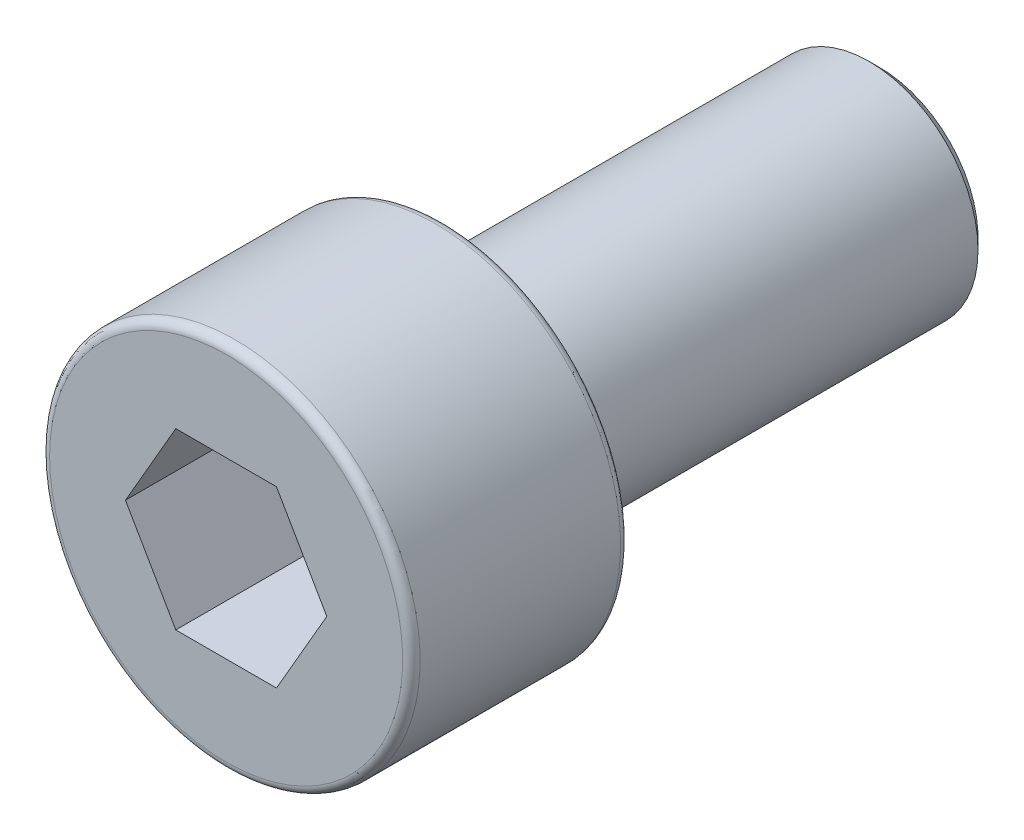
ISO-10303-21;
HEADER;
FILE_DESCRIPTION(('STEP AP214'),'2;1');
FILE_NAME('part.step','',(''),(''),'','','');
FILE_SCHEMA(('AUTOMOTIVE_DESIGN { 1 0 10303 214 1 1 1 1 }'));
ENDSEC;
DATA;
#1=APPLICATION_CONTEXT('core data for automotive mechanical design processes');
#2=APPLICATION_PROTOCOL_DEFINITION('international standard','automotive_design',2000,#1);
#3=PRODUCT_CONTEXT('',#1,'mechanical');
#4=PRODUCT('Part','Part','',(#3));
#5=PRODUCT_RELATED_PRODUCT_CATEGORY('part','',(#4));
#6=PRODUCT_DEFINITION_FORMATION('','',#4);
#7=PRODUCT_DEFINITION_CONTEXT('part definition',#1,'design');
#8=PRODUCT_DEFINITION('design','',#6,#7);
#9=PRODUCT_DEFINITION_SHAPE('','',#8);
#10=(LENGTH_UNIT() NAMED_UNIT(*) SI_UNIT(.MILLI.,.METRE.));
#11=(NAMED_UNIT(*) PLANE_ANGLE_UNIT() SI_UNIT($,.RADIAN.));
#12=(NAMED_UNIT(*) SI_UNIT($,.STERADIAN.) SOLID_ANGLE_UNIT());
#13=UNCERTAINTY_MEASURE_WITH_UNIT(LENGTH_MEASURE(1.E-05),#10,'distance_accuracy_value','');
#14=(GEOMETRIC_REPRESENTATION_CONTEXT(3) GLOBAL_UNCERTAINTY_ASSIGNED_CONTEXT((#13)) GLOBAL_UNIT_ASSIGNED_CONTEXT((#10,
#11,#12)) REPRESENTATION_CONTEXT('',''));
#15=CARTESIAN_POINT('',(0.,0.,0.));
#16=DIRECTION('',(0.,0.,1.));
#17=DIRECTION('',(1.,0.,0.));
#18=AXIS2_PLACEMENT_3D('',#15,#16,#17);
#19=CARTESIAN_POINT('',(0.,0.,10.));
#20=DIRECTION('',(0.,0.,-1.));
#21=DIRECTION('',(-1.,0.,0.));
#22=AXIS2_PLACEMENT_3D('',#19,#20,#21);
#23=PLANE('',#22);
#24=CARTESIAN_POINT('',(0.,0.,10.));
#25=DIRECTION('',(0.,0.,-1.));
#26=DIRECTION('',(-1.,0.,0.));
#27=AXIS2_PLACEMENT_3D('',#24,#25,#26);
#28=CIRCLE('',#27,4.05);
#29=CARTESIAN_POINT('',(-4.05,0.,10.));
#30=VERTEX_POINT('',#29);
#31=EDGE_CURVE('E40',#30,#30,#28,.T.);
#32=ORIENTED_EDGE('',*,*,#31,.T.);
#33=EDGE_LOOP('',(#32));
#34=FACE_BOUND('',#33,.T.);
#35=CARTESIAN_POINT('',(0.,0.,10.));
#36=DIRECTION('',(0.,0.,-1.));
#37=DIRECTION('',(-1.,0.,0.));
#38=AXIS2_PLACEMENT_3D('',#35,#36,#37);
#39=CIRCLE('',#38,2.5);
#40=CARTESIAN_POINT('',(-2.5,0.,10.));
#41=VERTEX_POINT('',#40);
#42=EDGE_CURVE('E134',#41,#41,#39,.T.);
#43=ORIENTED_EDGE('',*,*,#42,.F.);
#44=EDGE_LOOP('',(#43));
#45=FACE_BOUND('',#44,.T.);
#46=ADVANCED_FACE('F32',(#34,#45),#23,.T.);
#47=CARTESIAN_POINT('',(0.,0.,10.));
#48=DIRECTION('',(0.,0.,1.));
#49=DIRECTION('',(1.,0.,0.));
#50=AXIS2_PLACEMENT_3D('',#47,#48,#49);
#51=CYLINDRICAL_SURFACE('',#50,4.25);
#52=CARTESIAN_POINT('',(0.,0.,10.2));
#53=DIRECTION('',(0.,0.,-1.));
#54=DIRECTION('',(-1.,0.,0.));
#55=AXIS2_PLACEMENT_3D('',#52,#53,#54);
#56=CIRCLE('',#55,4.25);
#57=CARTESIAN_POINT('',(-4.25,0.,10.2));
#58=VERTEX_POINT('',#57);
#59=EDGE_CURVE('E151',#58,#58,#56,.F.);
#60=ORIENTED_EDGE('',*,*,#59,.T.);
#61=EDGE_LOOP('',(#60));
#62=FACE_BOUND('',#61,.T.);
#63=CARTESIAN_POINT('',(0.,0.,14.8));
#64=DIRECTION('',(0.,0.,-1.));
#65=DIRECTION('',(-1.,0.,0.));
#66=AXIS2_PLACEMENT_3D('',#63,#64,#65);
#67=CIRCLE('',#66,4.25);
#68=CARTESIAN_POINT('',(-4.25,0.,14.8));
#69=VERTEX_POINT('',#68);
#70=EDGE_CURVE('E148',#69,#69,#67,.T.);
#71=ORIENTED_EDGE('',*,*,#70,.T.);
#72=EDGE_LOOP('',(#71));
#73=FACE_BOUND('',#72,.T.);
#74=ADVANCED_FACE('F164',(#62,#73),#51,.T.);
#75=CARTESIAN_POINT('',(0.,0.,15.));
#76=DIRECTION('',(0.,0.,-1.));
#77=DIRECTION('',(-1.,0.,0.));
#78=AXIS2_PLACEMENT_3D('',#75,#76,#77);
#79=PLANE('',#78);
#80=CARTESIAN_POINT('',(0.,0.,15.));
#81=DIRECTION('',(0.,0.,-1.));
#82=DIRECTION('',(-1.,0.,0.));
#83=AXIS2_PLACEMENT_3D('',#80,#81,#82);
#84=CIRCLE('',#83,4.05);
#85=CARTESIAN_POINT('',(-4.05,0.,15.));
#86=VERTEX_POINT('',#85);
#87=EDGE_CURVE('E11',#86,#86,#84,.F.);
#88=ORIENTED_EDGE('',*,*,#87,.T.);
#89=EDGE_LOOP('',(#88));
#90=FACE_BOUND('',#89,.T.);
#91=DIRECTION('',(0.499999999999999,-0.866025403784439,0.));
#92=VECTOR('',#91,1.);
#93=CARTESIAN_POINT('',(-2.3094010767585,0.,15.));
#94=LINE('',#93,#92);
#95=CARTESIAN_POINT('',(-2.3094010767585,0.,15.));
#96=VERTEX_POINT('',#95);
#97=CARTESIAN_POINT('',(-1.15470053837925,-2.,15.));
#98=VERTEX_POINT('',#97);
#99=EDGE_CURVE('E121',#96,#98,#94,.T.);
#100=ORIENTED_EDGE('',*,*,#99,.F.);
#101=DIRECTION('',(-0.499999999999999,-0.866025403784439,0.));
#102=VECTOR('',#101,1.);
#103=CARTESIAN_POINT('',(-1.15470053837925,2.,15.));
#104=LINE('',#103,#102);
#105=CARTESIAN_POINT('',(-1.15470053837925,2.,15.));
#106=VERTEX_POINT('',#105);
#107=EDGE_CURVE('E47',#106,#96,#104,.T.);
#108=ORIENTED_EDGE('',*,*,#107,.F.);
#109=DIRECTION('',(-1.,0.,0.));
#110=VECTOR('',#109,1.);
#111=CARTESIAN_POINT('',(1.15470053837925,2.,15.));
#112=LINE('',#111,#110);
#113=CARTESIAN_POINT('',(1.15470053837925,2.,15.));
#114=VERTEX_POINT('',#113);
#115=EDGE_CURVE('E130',#114,#106,#112,.T.);
#116=ORIENTED_EDGE('',*,*,#115,.F.);
#117=DIRECTION('',(-0.499999999999999,0.866025403784439,0.));
#118=VECTOR('',#117,1.);
#119=CARTESIAN_POINT('',(2.3094010767585,0.,15.));
#120=LINE('',#119,#118);
#121=CARTESIAN_POINT('',(2.3094010767585,0.,15.));
#122=VERTEX_POINT('',#121);
#123=EDGE_CURVE('E128',#122,#114,#120,.T.);
#124=ORIENTED_EDGE('',*,*,#123,.F.);
#125=DIRECTION('',(0.499999999999999,0.866025403784439,0.));
#126=VECTOR('',#125,1.);
#127=CARTESIAN_POINT('',(1.15470053837925,-2.,15.));
#128=LINE('',#127,#126);
#129=CARTESIAN_POINT('',(1.15470053837925,-2.,15.));
#130=VERTEX_POINT('',#129);
#131=EDGE_CURVE('E95',#130,#122,#128,.T.);
#132=ORIENTED_EDGE('',*,*,#131,.F.);
#133=DIRECTION('',(1.,0.,0.));
#134=VECTOR('',#133,1.);
#135=CARTESIAN_POINT('',(-1.15470053837925,-2.,15.));
#136=LINE('',#135,#134);
#137=EDGE_CURVE('E124',#98,#130,#136,.T.);
#138=ORIENTED_EDGE('',*,*,#137,.F.);
#139=EDGE_LOOP('',(#100,#108,#116,#124,#132,#138));
#140=FACE_BOUND('',#139,.T.);
#141=ADVANCED_FACE('F167',(#90,#140),#79,.F.);
#142=CARTESIAN_POINT('',(0.,0.,0.));
#143=DIRECTION('',(0.,0.,1.));
#144=DIRECTION('',(1.,0.,0.));
#145=AXIS2_PLACEMENT_3D('',#142,#143,#144);
#146=CYLINDRICAL_SURFACE('',#145,2.5);
#147=CARTESIAN_POINT('',(0.,0.,0.250000000055023));
#148=DIRECTION('',(0.,0.,-1.));
#149=DIRECTION('',(-1.,0.,0.));
#150=AXIS2_PLACEMENT_3D('',#147,#148,#149);
#151=CIRCLE('',#150,2.5);
#152=CARTESIAN_POINT('',(-2.5,0.,0.250000000055023));
#153=VERTEX_POINT('',#152);
#154=EDGE_CURVE('E145',#153,#153,#151,.F.);
#155=ORIENTED_EDGE('',*,*,#154,.T.);
#156=EDGE_LOOP('',(#155));
#157=FACE_BOUND('',#156,.T.);
#158=ORIENTED_EDGE('',*,*,#42,.T.);
#159=EDGE_LOOP('',(#158));
#160=FACE_BOUND('',#159,.T.);
#161=ADVANCED_FACE('F177',(#157,#160),#146,.T.);
#162=CARTESIAN_POINT('',(0.,0.,0.));
#163=DIRECTION('',(0.,0.,-1.));
#164=DIRECTION('',(-1.,0.,0.));
#165=AXIS2_PLACEMENT_3D('',#162,#163,#164);
#166=PLANE('',#165);
#167=CARTESIAN_POINT('',(0.,0.,0.));
#168=DIRECTION('',(0.,0.,-1.));
#169=DIRECTION('',(-1.,0.,0.));
#170=AXIS2_PLACEMENT_3D('',#167,#168,#169);
#171=CIRCLE('',#170,2.24999999994497);
#172=CARTESIAN_POINT('',(-2.24999999994497,0.,0.));
#173=VERTEX_POINT('',#172);
#174=EDGE_CURVE('E142',#173,#173,#171,.T.);
#175=ORIENTED_EDGE('',*,*,#174,.T.);
#176=EDGE_LOOP('',(#175));
#177=FACE_BOUND('',#176,.T.);
#178=ADVANCED_FACE('F188',(#177),#166,.T.);
#179=CARTESIAN_POINT('',(-1.15470053837925,2.,11.));
#180=DIRECTION('',(-0.866025403784439,0.499999999999999,0.));
#181=DIRECTION('',(-0.499999999999999,-0.866025403784439,0.));
#182=AXIS2_PLACEMENT_3D('',#179,#180,#181);
#183=PLANE('',#182);
#184=ORIENTED_EDGE('',*,*,#107,.T.);
#185=DIRECTION('',(0.,0.,1.));
#186=VECTOR('',#185,1.);
#187=CARTESIAN_POINT('',(-2.3094010767585,0.,11.));
#188=LINE('',#187,#186);
#189=CARTESIAN_POINT('',(-2.3094010767585,0.,11.));
#190=VERTEX_POINT('',#189);
#191=EDGE_CURVE('E77',#190,#96,#188,.T.);
#192=ORIENTED_EDGE('',*,*,#191,.F.);
#193=DIRECTION('',(-0.499999999999999,-0.866025403784439,0.));
#194=VECTOR('',#193,1.);
#195=CARTESIAN_POINT('',(-1.15470053837925,2.,11.));
#196=LINE('',#195,#194);
#197=CARTESIAN_POINT('',(-1.15470053837925,2.,11.));
#198=VERTEX_POINT('',#197);
#199=EDGE_CURVE('E132',#198,#190,#196,.T.);
#200=ORIENTED_EDGE('',*,*,#199,.F.);
#201=DIRECTION('',(0.,0.,1.));
#202=VECTOR('',#201,1.);
#203=CARTESIAN_POINT('',(-1.15470053837925,2.,11.));
#204=LINE('',#203,#202);
#205=EDGE_CURVE('E55',#198,#106,#204,.T.);
#206=ORIENTED_EDGE('',*,*,#205,.T.);
#207=EDGE_LOOP('',(#184,#192,#200,#206));
#208=FACE_BOUND('',#207,.T.);
#209=ADVANCED_FACE('F185',(#208),#183,.F.);
#210=CARTESIAN_POINT('',(1.15470053837925,2.,11.));
#211=DIRECTION('',(0.,1.,0.));
#212=DIRECTION('',(-1.,0.,0.));
#213=AXIS2_PLACEMENT_3D('',#210,#211,#212);
#214=PLANE('',#213);
#215=ORIENTED_EDGE('',*,*,#115,.T.);
#216=ORIENTED_EDGE('',*,*,#205,.F.);
#217=DIRECTION('',(-1.,0.,0.));
#218=VECTOR('',#217,1.);
#219=CARTESIAN_POINT('',(1.15470053837925,2.,11.));
#220=LINE('',#219,#218);
#221=CARTESIAN_POINT('',(1.15470053837925,2.,11.));
#222=VERTEX_POINT('',#221);
#223=EDGE_CURVE('E107',#222,#198,#220,.T.);
#224=ORIENTED_EDGE('',*,*,#223,.F.);
#225=DIRECTION('',(0.,0.,1.));
#226=VECTOR('',#225,1.);
#227=CARTESIAN_POINT('',(1.15470053837925,2.,11.));
#228=LINE('',#227,#226);
#229=EDGE_CURVE('E99',#222,#114,#228,.T.);
#230=ORIENTED_EDGE('',*,*,#229,.T.);
#231=EDGE_LOOP('',(#215,#216,#224,#230));
#232=FACE_BOUND('',#231,.T.);
#233=ADVANCED_FACE('F187',(#232),#214,.F.);
#234=CARTESIAN_POINT('',(2.3094010767585,0.,11.));
#235=DIRECTION('',(0.866025403784439,0.499999999999999,0.));
#236=DIRECTION('',(-0.499999999999999,0.866025403784439,0.));
#237=AXIS2_PLACEMENT_3D('',#234,#235,#236);
#238=PLANE('',#237);
#239=ORIENTED_EDGE('',*,*,#123,.T.);
#240=ORIENTED_EDGE('',*,*,#229,.F.);
#241=DIRECTION('',(-0.499999999999999,0.866025403784439,0.));
#242=VECTOR('',#241,1.);
#243=CARTESIAN_POINT('',(2.3094010767585,0.,11.));
#244=LINE('',#243,#242);
#245=CARTESIAN_POINT('',(2.3094010767585,0.,11.));
#246=VERTEX_POINT('',#245);
#247=EDGE_CURVE('E103',#246,#222,#244,.T.);
#248=ORIENTED_EDGE('',*,*,#247,.F.);
#249=DIRECTION('',(0.,0.,1.));
#250=VECTOR('',#249,1.);
#251=CARTESIAN_POINT('',(2.3094010767585,0.,11.));
#252=LINE('',#251,#250);
#253=EDGE_CURVE('E88',#246,#122,#252,.T.);
#254=ORIENTED_EDGE('',*,*,#253,.T.);
#255=EDGE_LOOP('',(#239,#240,#248,#254));
#256=FACE_BOUND('',#255,.T.);
#257=ADVANCED_FACE('F104',(#256),#238,.F.);
#258=CARTESIAN_POINT('',(1.15470053837925,-2.,11.));
#259=DIRECTION('',(0.866025403784439,-0.5,0.));
#260=DIRECTION('',(0.5,0.866025403784439,0.));
#261=AXIS2_PLACEMENT_3D('',#258,#259,#260);
#262=PLANE('',#261);
#263=ORIENTED_EDGE('',*,*,#131,.T.);
#264=ORIENTED_EDGE('',*,*,#253,.F.);
#265=DIRECTION('',(0.499999999999999,0.866025403784439,0.));
#266=VECTOR('',#265,1.);
#267=CARTESIAN_POINT('',(1.15470053837925,-2.,11.));
#268=LINE('',#267,#266);
#269=CARTESIAN_POINT('',(1.15470053837925,-2.,11.));
#270=VERTEX_POINT('',#269);
#271=EDGE_CURVE('E92',#270,#246,#268,.T.);
#272=ORIENTED_EDGE('',*,*,#271,.F.);
#273=DIRECTION('',(0.,0.,1.));
#274=VECTOR('',#273,1.);
#275=CARTESIAN_POINT('',(1.15470053837925,-2.,11.));
#276=LINE('',#275,#274);
#277=EDGE_CURVE('E100',#270,#130,#276,.T.);
#278=ORIENTED_EDGE('',*,*,#277,.T.);
#279=EDGE_LOOP('',(#263,#264,#272,#278));
#280=FACE_BOUND('',#279,.T.);
#281=ADVANCED_FACE('F90',(#280),#262,.F.);
#282=CARTESIAN_POINT('',(-1.15470053837925,-2.,11.));
#283=DIRECTION('',(0.,-1.,0.));
#284=DIRECTION('',(1.,0.,0.));
#285=AXIS2_PLACEMENT_3D('',#282,#283,#284);
#286=PLANE('',#285);
#287=ORIENTED_EDGE('',*,*,#137,.T.);
#288=ORIENTED_EDGE('',*,*,#277,.F.);
#289=DIRECTION('',(1.,0.,0.));
#290=VECTOR('',#289,1.);
#291=CARTESIAN_POINT('',(-1.15470053837925,-2.,11.));
#292=LINE('',#291,#290);
#293=CARTESIAN_POINT('',(-1.15470053837925,-2.,11.));
#294=VERTEX_POINT('',#293);
#295=EDGE_CURVE('E113',#294,#270,#292,.T.);
#296=ORIENTED_EDGE('',*,*,#295,.F.);
#297=DIRECTION('',(0.,0.,1.));
#298=VECTOR('',#297,1.);
#299=CARTESIAN_POINT('',(-1.15470053837925,-2.,11.));
#300=LINE('',#299,#298);
#301=EDGE_CURVE('E137',#294,#98,#300,.T.);
#302=ORIENTED_EDGE('',*,*,#301,.T.);
#303=EDGE_LOOP('',(#287,#288,#296,#302));
#304=FACE_BOUND('',#303,.T.);
#305=ADVANCED_FACE('F273',(#304),#286,.F.);
#306=CARTESIAN_POINT('',(-2.3094010767585,0.,11.));
#307=DIRECTION('',(-0.866025403784439,-0.499999999999999,0.));
#308=DIRECTION('',(0.499999999999999,-0.866025403784439,0.));
#309=AXIS2_PLACEMENT_3D('',#306,#307,#308);
#310=PLANE('',#309);
#311=ORIENTED_EDGE('',*,*,#99,.T.);
#312=ORIENTED_EDGE('',*,*,#301,.F.);
#313=DIRECTION('',(0.499999999999999,-0.866025403784439,0.));
#314=VECTOR('',#313,1.);
#315=CARTESIAN_POINT('',(-2.3094010767585,0.,11.));
#316=LINE('',#315,#314);
#317=EDGE_CURVE('E115',#190,#294,#316,.T.);
#318=ORIENTED_EDGE('',*,*,#317,.F.);
#319=ORIENTED_EDGE('',*,*,#191,.T.);
#320=EDGE_LOOP('',(#311,#312,#318,#319));
#321=FACE_BOUND('',#320,.T.);
#322=ADVANCED_FACE('F183',(#321),#310,.F.);
#323=CARTESIAN_POINT('',(0.,0.,11.));
#324=DIRECTION('',(0.,0.,1.));
#325=DIRECTION('',(1.,0.,0.));
#326=AXIS2_PLACEMENT_3D('',#323,#324,#325);
#327=PLANE('',#326);
#328=ORIENTED_EDGE('',*,*,#199,.T.);
#329=ORIENTED_EDGE('',*,*,#317,.T.);
#330=ORIENTED_EDGE('',*,*,#295,.T.);
#331=ORIENTED_EDGE('',*,*,#271,.T.);
#332=ORIENTED_EDGE('',*,*,#247,.T.);
#333=ORIENTED_EDGE('',*,*,#223,.T.);
#334=EDGE_LOOP('',(#328,#329,#330,#331,#332,#333));
#335=FACE_BOUND('',#334,.T.);
#336=ADVANCED_FACE('F110',(#335),#327,.T.);
#337=CARTESIAN_POINT('',(0.,0.,0.));
#338=DIRECTION('',(0.,0.,1.));
#339=DIRECTION('',(1.,0.,0.));
#340=AXIS2_PLACEMENT_3D('',#337,#338,#339);
#341=CONICAL_SURFACE('',#340,2.24999999994497,0.785398163397453);
#342=ORIENTED_EDGE('',*,*,#154,.F.);
#343=EDGE_LOOP('',(#342));
#344=FACE_BOUND('',#343,.T.);
#345=ORIENTED_EDGE('',*,*,#174,.F.);
#346=EDGE_LOOP('',(#345));
#347=FACE_BOUND('',#346,.T.);
#348=ADVANCED_FACE('F161',(#344,#347),#341,.T.);
#349=CARTESIAN_POINT('',(0.,0.,10.2));
#350=DIRECTION('',(0.,0.,-1.));
#351=DIRECTION('',(-1.,0.,0.));
#352=AXIS2_PLACEMENT_3D('',#349,#350,#351);
#353=TOROIDAL_SURFACE('',#352,4.05,0.2);
#354=ORIENTED_EDGE('',*,*,#31,.F.);
#355=EDGE_LOOP('',(#354));
#356=FACE_BOUND('',#355,.T.);
#357=ORIENTED_EDGE('',*,*,#59,.F.);
#358=EDGE_LOOP('',(#357));
#359=FACE_BOUND('',#358,.T.);
#360=ADVANCED_FACE('F158',(#356,#359),#353,.T.);
#361=CARTESIAN_POINT('',(0.,0.,14.8));
#362=DIRECTION('',(0.,0.,-1.));
#363=DIRECTION('',(-1.,0.,0.));
#364=AXIS2_PLACEMENT_3D('',#361,#362,#363);
#365=TOROIDAL_SURFACE('',#364,4.05,0.2);
#366=ORIENTED_EDGE('',*,*,#70,.F.);
#367=EDGE_LOOP('',(#366));
#368=FACE_BOUND('',#367,.T.);
#369=ORIENTED_EDGE('',*,*,#87,.F.);
#370=EDGE_LOOP('',(#369));
#371=FACE_BOUND('',#370,.T.);
#372=ADVANCED_FACE('F34',(#368,#371),#365,.T.);
#373=CLOSED_SHELL('',(#46,#74,#141,#161,#178,#209,#233,#257,#281,#305,#322,#336,#348,#360,#372));
#374=MANIFOLD_SOLID_BREP('B2',#373);
#375=ADVANCED_BREP_SHAPE_REPRESENTATION('',(#18,#374),#14);
#376=SHAPE_DEFINITION_REPRESENTATION(#9,#375);
ENDSEC;
END-ISO-10303-21;
